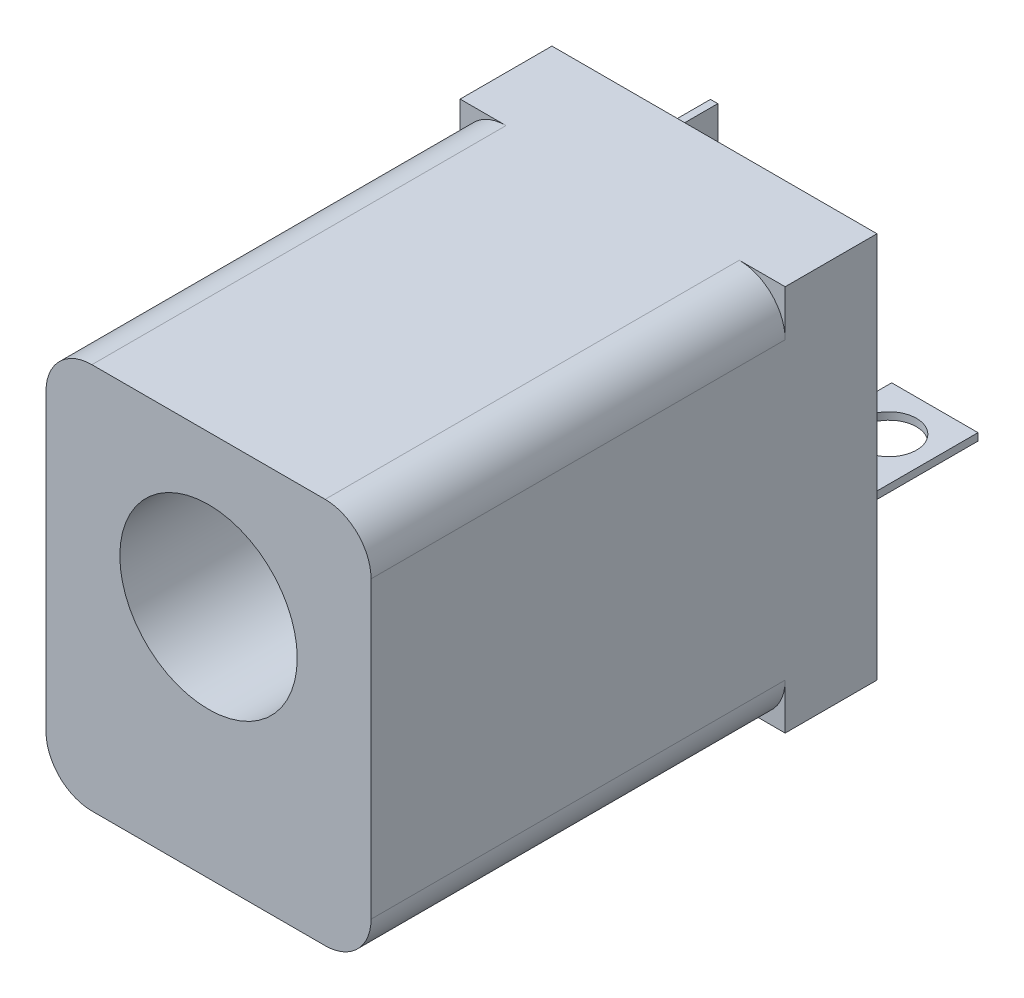
ISO-10303-21;
HEADER;
FILE_DESCRIPTION(('STEP AP214'),'2;1');
FILE_NAME('part.step','',(''),(''),'','','');
FILE_SCHEMA(('AUTOMOTIVE_DESIGN { 1 0 10303 214 1 1 1 1 }'));
ENDSEC;
DATA;
#1=APPLICATION_CONTEXT('core data for automotive mechanical design processes');
#2=APPLICATION_PROTOCOL_DEFINITION('international standard','automotive_design',2000,#1);
#3=PRODUCT_CONTEXT('',#1,'mechanical');
#4=PRODUCT('Part','Part','',(#3));
#5=PRODUCT_RELATED_PRODUCT_CATEGORY('part','',(#4));
#6=PRODUCT_DEFINITION_FORMATION('','',#4);
#7=PRODUCT_DEFINITION_CONTEXT('part definition',#1,'design');
#8=PRODUCT_DEFINITION('design','',#6,#7);
#9=PRODUCT_DEFINITION_SHAPE('','',#8);
#10=(LENGTH_UNIT() NAMED_UNIT(*) SI_UNIT(.MILLI.,.METRE.));
#11=(NAMED_UNIT(*) PLANE_ANGLE_UNIT() SI_UNIT($,.RADIAN.));
#12=(NAMED_UNIT(*) SI_UNIT($,.STERADIAN.) SOLID_ANGLE_UNIT());
#13=UNCERTAINTY_MEASURE_WITH_UNIT(LENGTH_MEASURE(1.E-05),#10,'distance_accuracy_value','');
#14=(GEOMETRIC_REPRESENTATION_CONTEXT(3) GLOBAL_UNCERTAINTY_ASSIGNED_CONTEXT((#13)) GLOBAL_UNIT_ASSIGNED_CONTEXT((#10,
#11,#12)) REPRESENTATION_CONTEXT('',''));
#15=CARTESIAN_POINT('',(0.,0.,0.));
#16=DIRECTION('',(0.,0.,1.));
#17=DIRECTION('',(1.,0.,0.));
#18=AXIS2_PLACEMENT_3D('',#15,#16,#17);
#19=CARTESIAN_POINT('',(1.27,1.27,-13.9954));
#20=DIRECTION('',(0.,0.,1.));
#21=DIRECTION('',(1.,0.,0.));
#22=AXIS2_PLACEMENT_3D('',#19,#20,#21);
#23=PLANE('',#22);
#24=DIRECTION('',(0.,-1.,0.));
#25=VECTOR('',#24,1.);
#26=CARTESIAN_POINT('',(4.4069,1.20396,-13.9954));
#27=LINE('',#26,#25);
#28=CARTESIAN_POINT('',(4.4069,1.20396,-13.9954));
#29=VERTEX_POINT('',#28);
#30=CARTESIAN_POINT('',(4.4069,1.00076,-13.9954));
#31=VERTEX_POINT('',#30);
#32=EDGE_CURVE('E224',#29,#31,#27,.T.);
#33=ORIENTED_EDGE('',*,*,#32,.F.);
#34=DIRECTION('',(1.,0.,0.));
#35=VECTOR('',#34,1.);
#36=CARTESIAN_POINT('',(4.4069,1.20396,-13.9954));
#37=LINE('',#36,#35);
#38=CARTESIAN_POINT('',(2.1971,1.20396,-13.9954));
#39=VERTEX_POINT('',#38);
#40=EDGE_CURVE('E242',#39,#29,#37,.T.);
#41=ORIENTED_EDGE('',*,*,#40,.F.);
#42=DIRECTION('',(0.,1.,0.));
#43=VECTOR('',#42,1.);
#44=CARTESIAN_POINT('',(2.1971,1.20396,-13.9954));
#45=LINE('',#44,#43);
#46=CARTESIAN_POINT('',(2.1971,1.00076,-13.9954));
#47=VERTEX_POINT('',#46);
#48=EDGE_CURVE('E255',#47,#39,#45,.T.);
#49=ORIENTED_EDGE('',*,*,#48,.F.);
#50=DIRECTION('',(-1.,0.,0.));
#51=VECTOR('',#50,1.);
#52=CARTESIAN_POINT('',(4.4069,1.00076,-13.9954));
#53=LINE('',#52,#51);
#54=EDGE_CURVE('E230',#31,#47,#53,.T.);
#55=ORIENTED_EDGE('',*,*,#54,.F.);
#56=EDGE_LOOP('',(#33,#41,#49,#55));
#57=FACE_BOUND('',#56,.T.);
#58=DIRECTION('',(1.,0.,0.));
#59=VECTOR('',#58,1.);
#60=CARTESIAN_POINT('',(1.27000000000001,0.,-13.9954));
#61=LINE('',#60,#59);
#62=CARTESIAN_POINT('',(0.,0.,-13.9954));
#63=VERTEX_POINT('',#62);
#64=CARTESIAN_POINT('',(8.9916,0.,-13.9954));
#65=VERTEX_POINT('',#64);
#66=EDGE_CURVE('E377',#63,#65,#61,.T.);
#67=ORIENTED_EDGE('',*,*,#66,.F.);
#68=DIRECTION('',(0.,-1.,0.));
#69=VECTOR('',#68,1.);
#70=CARTESIAN_POINT('',(0.,1.27000000000001,-13.9954));
#71=LINE('',#70,#69);
#72=CARTESIAN_POINT('',(0.,10.6934,-13.9954));
#73=VERTEX_POINT('',#72);
#74=EDGE_CURVE('E388',#73,#63,#71,.T.);
#75=ORIENTED_EDGE('',*,*,#74,.F.);
#76=DIRECTION('',(-1.,0.,0.));
#77=VECTOR('',#76,1.);
#78=CARTESIAN_POINT('',(1.27000000000001,10.6934,-13.9954));
#79=LINE('',#78,#77);
#80=CARTESIAN_POINT('',(8.9916,10.6934,-13.9954));
#81=VERTEX_POINT('',#80);
#82=EDGE_CURVE('E385',#81,#73,#79,.T.);
#83=ORIENTED_EDGE('',*,*,#82,.F.);
#84=DIRECTION('',(0.,1.,0.));
#85=VECTOR('',#84,1.);
#86=CARTESIAN_POINT('',(8.9916,1.27000000000001,-13.9954));
#87=LINE('',#86,#85);
#88=EDGE_CURVE('E381',#65,#81,#87,.T.);
#89=ORIENTED_EDGE('',*,*,#88,.F.);
#90=EDGE_LOOP('',(#67,#75,#83,#89));
#91=FACE_BOUND('',#90,.T.);
#92=DIRECTION('',(0.,-1.,0.));
#93=VECTOR('',#92,1.);
#94=CARTESIAN_POINT('',(0.980439999999999,8.001,-13.9954));
#95=LINE('',#94,#93);
#96=CARTESIAN_POINT('',(0.980439999999999,8.001,-13.9954));
#97=VERTEX_POINT('',#96);
#98=CARTESIAN_POINT('',(0.980439999999999,5.0038,-13.9954));
#99=VERTEX_POINT('',#98);
#100=EDGE_CURVE('E276',#97,#99,#95,.T.);
#101=ORIENTED_EDGE('',*,*,#100,.F.);
#102=DIRECTION('',(1.,0.,0.));
#103=VECTOR('',#102,1.);
#104=CARTESIAN_POINT('',(0.980439999999999,8.001,-13.9954));
#105=LINE('',#104,#103);
#106=CARTESIAN_POINT('',(0.777239999999999,8.001,-13.9954));
#107=VERTEX_POINT('',#106);
#108=EDGE_CURVE('E281',#107,#97,#105,.T.);
#109=ORIENTED_EDGE('',*,*,#108,.F.);
#110=DIRECTION('',(0.,1.,0.));
#111=VECTOR('',#110,1.);
#112=CARTESIAN_POINT('',(0.777239999999999,8.001,-13.9954));
#113=LINE('',#112,#111);
#114=CARTESIAN_POINT('',(0.777239999999999,5.0038,-13.9954));
#115=VERTEX_POINT('',#114);
#116=EDGE_CURVE('E298',#115,#107,#113,.T.);
#117=ORIENTED_EDGE('',*,*,#116,.F.);
#118=DIRECTION('',(-1.,0.,0.));
#119=VECTOR('',#118,1.);
#120=CARTESIAN_POINT('',(0.980439999999999,5.0038,-13.9954));
#121=LINE('',#120,#119);
#122=EDGE_CURVE('E294',#99,#115,#121,.T.);
#123=ORIENTED_EDGE('',*,*,#122,.F.);
#124=EDGE_LOOP('',(#101,#109,#117,#123));
#125=FACE_BOUND('',#124,.T.);
#126=DIRECTION('',(0.,-1.,0.));
#127=VECTOR('',#126,1.);
#128=CARTESIAN_POINT('',(8.1788,3.71856,-13.9954));
#129=LINE('',#128,#127);
#130=CARTESIAN_POINT('',(8.1788,3.71856,-13.9954));
#131=VERTEX_POINT('',#130);
#132=CARTESIAN_POINT('',(8.1788,3.51536,-13.9954));
#133=VERTEX_POINT('',#132);
#134=EDGE_CURVE('E222',#131,#133,#129,.T.);
#135=ORIENTED_EDGE('',*,*,#134,.F.);
#136=DIRECTION('',(1.,0.,0.));
#137=VECTOR('',#136,1.);
#138=CARTESIAN_POINT('',(8.1788,3.71856,-13.9954));
#139=LINE('',#138,#137);
#140=CARTESIAN_POINT('',(5.7912,3.71856,-13.9954));
#141=VERTEX_POINT('',#140);
#142=EDGE_CURVE('E219',#141,#131,#139,.T.);
#143=ORIENTED_EDGE('',*,*,#142,.F.);
#144=DIRECTION('',(0.,1.,0.));
#145=VECTOR('',#144,1.);
#146=CARTESIAN_POINT('',(5.7912,3.71856,-13.9954));
#147=LINE('',#146,#145);
#148=CARTESIAN_POINT('',(5.7912,3.51536,-13.9954));
#149=VERTEX_POINT('',#148);
#150=EDGE_CURVE('E60',#149,#141,#147,.T.);
#151=ORIENTED_EDGE('',*,*,#150,.F.);
#152=DIRECTION('',(-1.,0.,0.));
#153=VECTOR('',#152,1.);
#154=CARTESIAN_POINT('',(8.1788,3.51536,-13.9954));
#155=LINE('',#154,#153);
#156=EDGE_CURVE('E55',#133,#149,#155,.T.);
#157=ORIENTED_EDGE('',*,*,#156,.F.);
#158=EDGE_LOOP('',(#135,#143,#151,#157));
#159=FACE_BOUND('',#158,.T.);
#160=ADVANCED_FACE('F37',(#57,#91,#125,#159),#23,.F.);
#161=CARTESIAN_POINT('',(1.27,1.27,-13.9954));
#162=DIRECTION('',(0.,0.,1.));
#163=DIRECTION('',(1.,0.,0.));
#164=AXIS2_PLACEMENT_3D('',#161,#162,#163);
#165=CYLINDRICAL_SURFACE('',#164,1.27);
#166=DIRECTION('',(0.,0.,1.));
#167=VECTOR('',#166,1.);
#168=CARTESIAN_POINT('',(0.,1.27000000000001,-13.9954));
#169=LINE('',#168,#167);
#170=CARTESIAN_POINT('',(0.,1.27000000000001,-11.4554));
#171=VERTEX_POINT('',#170);
#172=CARTESIAN_POINT('',(0.,1.27000000000001,0.));
#173=VERTEX_POINT('',#172);
#174=EDGE_CURVE('E11',#171,#173,#169,.T.);
#175=ORIENTED_EDGE('',*,*,#174,.F.);
#176=CARTESIAN_POINT('',(1.27,1.27,-11.4554));
#177=DIRECTION('',(0.,0.,-1.));
#178=DIRECTION('',(-1.,0.,0.));
#179=AXIS2_PLACEMENT_3D('',#176,#177,#178);
#180=CIRCLE('',#179,1.27);
#181=CARTESIAN_POINT('',(1.27000000000001,0.,-11.4554));
#182=VERTEX_POINT('',#181);
#183=EDGE_CURVE('E365',#171,#182,#180,.F.);
#184=ORIENTED_EDGE('',*,*,#183,.T.);
#185=DIRECTION('',(0.,0.,1.));
#186=VECTOR('',#185,1.);
#187=CARTESIAN_POINT('',(1.27000000000001,0.,-13.9954));
#188=LINE('',#187,#186);
#189=CARTESIAN_POINT('',(1.27000000000001,0.,0.));
#190=VERTEX_POINT('',#189);
#191=EDGE_CURVE('E41',#182,#190,#188,.T.);
#192=ORIENTED_EDGE('',*,*,#191,.T.);
#193=CARTESIAN_POINT('',(1.27,1.27,0.));
#194=DIRECTION('',(0.,0.,1.));
#195=DIRECTION('',(1.,0.,0.));
#196=AXIS2_PLACEMENT_3D('',#193,#194,#195);
#197=CIRCLE('',#196,1.27);
#198=EDGE_CURVE('E373',#173,#190,#197,.T.);
#199=ORIENTED_EDGE('',*,*,#198,.F.);
#200=EDGE_LOOP('',(#175,#184,#192,#199));
#201=FACE_BOUND('',#200,.T.);
#202=ADVANCED_FACE('F39',(#201),#165,.T.);
#203=CARTESIAN_POINT('',(1.27,9.4234,-13.9954));
#204=DIRECTION('',(0.,0.,1.));
#205=DIRECTION('',(1.,0.,0.));
#206=AXIS2_PLACEMENT_3D('',#203,#204,#205);
#207=CYLINDRICAL_SURFACE('',#206,1.27);
#208=DIRECTION('',(0.,0.,1.));
#209=VECTOR('',#208,1.);
#210=CARTESIAN_POINT('',(1.27000000000001,10.6934,-13.9954));
#211=LINE('',#210,#209);
#212=CARTESIAN_POINT('',(1.27000000000001,10.6934,-11.4554));
#213=VERTEX_POINT('',#212);
#214=CARTESIAN_POINT('',(1.27000000000001,10.6934,0.));
#215=VERTEX_POINT('',#214);
#216=EDGE_CURVE('E423',#213,#215,#211,.T.);
#217=ORIENTED_EDGE('',*,*,#216,.F.);
#218=CARTESIAN_POINT('',(1.27,9.4234,-11.4554));
#219=DIRECTION('',(0.,0.,-1.));
#220=DIRECTION('',(-1.,0.,0.));
#221=AXIS2_PLACEMENT_3D('',#218,#219,#220);
#222=CIRCLE('',#221,1.27);
#223=CARTESIAN_POINT('',(0.,9.42339999999999,-11.4554));
#224=VERTEX_POINT('',#223);
#225=EDGE_CURVE('E362',#213,#224,#222,.F.);
#226=ORIENTED_EDGE('',*,*,#225,.T.);
#227=DIRECTION('',(0.,0.,1.));
#228=VECTOR('',#227,1.);
#229=CARTESIAN_POINT('',(0.,9.42339999999999,-13.9954));
#230=LINE('',#229,#228);
#231=CARTESIAN_POINT('',(0.,9.42339999999999,0.));
#232=VERTEX_POINT('',#231);
#233=EDGE_CURVE('E47',#224,#232,#230,.T.);
#234=ORIENTED_EDGE('',*,*,#233,.T.);
#235=CARTESIAN_POINT('',(1.27,9.4234,0.));
#236=DIRECTION('',(0.,0.,1.));
#237=DIRECTION('',(1.,0.,0.));
#238=AXIS2_PLACEMENT_3D('',#235,#236,#237);
#239=CIRCLE('',#238,1.27);
#240=EDGE_CURVE('E414',#215,#232,#239,.T.);
#241=ORIENTED_EDGE('',*,*,#240,.F.);
#242=EDGE_LOOP('',(#217,#226,#234,#241));
#243=FACE_BOUND('',#242,.T.);
#244=ADVANCED_FACE('F512',(#243),#207,.T.);
#245=CARTESIAN_POINT('',(7.7216,9.4234,-13.9954));
#246=DIRECTION('',(0.,0.,1.));
#247=DIRECTION('',(1.,0.,0.));
#248=AXIS2_PLACEMENT_3D('',#245,#246,#247);
#249=CYLINDRICAL_SURFACE('',#248,1.27);
#250=DIRECTION('',(0.,0.,1.));
#251=VECTOR('',#250,1.);
#252=CARTESIAN_POINT('',(8.9916,9.42339999999999,-13.9954));
#253=LINE('',#252,#251);
#254=CARTESIAN_POINT('',(8.9916,9.42339999999999,-11.4554));
#255=VERTEX_POINT('',#254);
#256=CARTESIAN_POINT('',(8.9916,9.42339999999999,0.));
#257=VERTEX_POINT('',#256);
#258=EDGE_CURVE('E429',#255,#257,#253,.T.);
#259=ORIENTED_EDGE('',*,*,#258,.F.);
#260=CARTESIAN_POINT('',(7.7216,9.4234,-11.4554));
#261=DIRECTION('',(0.,0.,-1.));
#262=DIRECTION('',(-1.,0.,0.));
#263=AXIS2_PLACEMENT_3D('',#260,#261,#262);
#264=CIRCLE('',#263,1.27);
#265=CARTESIAN_POINT('',(7.72159999999999,10.6934,-11.4554));
#266=VERTEX_POINT('',#265);
#267=EDGE_CURVE('E359',#255,#266,#264,.F.);
#268=ORIENTED_EDGE('',*,*,#267,.T.);
#269=DIRECTION('',(0.,0.,1.));
#270=VECTOR('',#269,1.);
#271=CARTESIAN_POINT('',(7.72159999999999,10.6934,-13.9954));
#272=LINE('',#271,#270);
#273=CARTESIAN_POINT('',(7.72159999999999,10.6934,0.));
#274=VERTEX_POINT('',#273);
#275=EDGE_CURVE('E426',#266,#274,#272,.T.);
#276=ORIENTED_EDGE('',*,*,#275,.T.);
#277=CARTESIAN_POINT('',(7.7216,9.4234,0.));
#278=DIRECTION('',(0.,0.,1.));
#279=DIRECTION('',(1.,0.,0.));
#280=AXIS2_PLACEMENT_3D('',#277,#278,#279);
#281=CIRCLE('',#280,1.27);
#282=EDGE_CURVE('E406',#257,#274,#281,.T.);
#283=ORIENTED_EDGE('',*,*,#282,.F.);
#284=EDGE_LOOP('',(#259,#268,#276,#283));
#285=FACE_BOUND('',#284,.T.);
#286=ADVANCED_FACE('F527',(#285),#249,.T.);
#287=CARTESIAN_POINT('',(7.7216,1.27,-13.9954));
#288=DIRECTION('',(0.,0.,1.));
#289=DIRECTION('',(1.,0.,0.));
#290=AXIS2_PLACEMENT_3D('',#287,#288,#289);
#291=CYLINDRICAL_SURFACE('',#290,1.27);
#292=DIRECTION('',(0.,0.,1.));
#293=VECTOR('',#292,1.);
#294=CARTESIAN_POINT('',(7.72159999999999,0.,-13.9954));
#295=LINE('',#294,#293);
#296=CARTESIAN_POINT('',(7.72159999999999,0.,-11.4554));
#297=VERTEX_POINT('',#296);
#298=CARTESIAN_POINT('',(7.72159999999999,0.,0.));
#299=VERTEX_POINT('',#298);
#300=EDGE_CURVE('E434',#297,#299,#295,.T.);
#301=ORIENTED_EDGE('',*,*,#300,.F.);
#302=CARTESIAN_POINT('',(7.7216,1.27,-11.4554));
#303=DIRECTION('',(0.,0.,-1.));
#304=DIRECTION('',(-1.,0.,0.));
#305=AXIS2_PLACEMENT_3D('',#302,#303,#304);
#306=CIRCLE('',#305,1.27);
#307=CARTESIAN_POINT('',(8.9916,1.27000000000001,-11.4554));
#308=VERTEX_POINT('',#307);
#309=EDGE_CURVE('E345',#297,#308,#306,.F.);
#310=ORIENTED_EDGE('',*,*,#309,.T.);
#311=DIRECTION('',(0.,0.,1.));
#312=VECTOR('',#311,1.);
#313=CARTESIAN_POINT('',(8.9916,1.27000000000001,-13.9954));
#314=LINE('',#313,#312);
#315=CARTESIAN_POINT('',(8.9916,1.27000000000001,0.));
#316=VERTEX_POINT('',#315);
#317=EDGE_CURVE('E432',#308,#316,#314,.T.);
#318=ORIENTED_EDGE('',*,*,#317,.T.);
#319=CARTESIAN_POINT('',(7.7216,1.27,0.));
#320=DIRECTION('',(0.,0.,1.));
#321=DIRECTION('',(1.,0.,0.));
#322=AXIS2_PLACEMENT_3D('',#319,#320,#321);
#323=CIRCLE('',#322,1.27);
#324=EDGE_CURVE('E398',#299,#316,#323,.T.);
#325=ORIENTED_EDGE('',*,*,#324,.F.);
#326=EDGE_LOOP('',(#301,#310,#318,#325));
#327=FACE_BOUND('',#326,.T.);
#328=ADVANCED_FACE('F524',(#327),#291,.T.);
#329=CARTESIAN_POINT('',(0.,1.27000000000001,-13.9954));
#330=DIRECTION('',(-1.,0.,0.));
#331=DIRECTION('',(0.,0.,1.));
#332=AXIS2_PLACEMENT_3D('',#329,#330,#331);
#333=PLANE('',#332);
#334=ORIENTED_EDGE('',*,*,#74,.T.);
#335=DIRECTION('',(0.,0.,-1.));
#336=VECTOR('',#335,1.);
#337=CARTESIAN_POINT('',(0.,0.,-11.4554));
#338=LINE('',#337,#336);
#339=CARTESIAN_POINT('',(0.,0.,-11.4554));
#340=VERTEX_POINT('',#339);
#341=EDGE_CURVE('E350',#340,#63,#338,.T.);
#342=ORIENTED_EDGE('',*,*,#341,.F.);
#343=DIRECTION('',(0.,1.,0.));
#344=VECTOR('',#343,1.);
#345=CARTESIAN_POINT('',(0.,10.6934,-11.4554));
#346=LINE('',#345,#344);
#347=EDGE_CURVE('E331',#340,#171,#346,.T.);
#348=ORIENTED_EDGE('',*,*,#347,.T.);
#349=ORIENTED_EDGE('',*,*,#174,.T.);
#350=DIRECTION('',(0.,-1.,0.));
#351=VECTOR('',#350,1.);
#352=CARTESIAN_POINT('',(0.,1.27000000000001,0.));
#353=LINE('',#352,#351);
#354=EDGE_CURVE('E382',#232,#173,#353,.T.);
#355=ORIENTED_EDGE('',*,*,#354,.F.);
#356=ORIENTED_EDGE('',*,*,#233,.F.);
#357=CARTESIAN_POINT('',(0.,10.6934,-11.4554));
#358=VERTEX_POINT('',#357);
#359=EDGE_CURVE('E330',#224,#358,#346,.T.);
#360=ORIENTED_EDGE('',*,*,#359,.T.);
#361=DIRECTION('',(0.,0.,-1.));
#362=VECTOR('',#361,1.);
#363=CARTESIAN_POINT('',(0.,10.6934,-11.4554));
#364=LINE('',#363,#362);
#365=EDGE_CURVE('E346',#358,#73,#364,.T.);
#366=ORIENTED_EDGE('',*,*,#365,.T.);
#367=EDGE_LOOP('',(#334,#342,#348,#349,#355,#356,#360,#366));
#368=FACE_BOUND('',#367,.T.);
#369=ADVANCED_FACE('F453',(#368),#333,.T.);
#370=CARTESIAN_POINT('',(1.27000000000001,10.6934,-13.9954));
#371=DIRECTION('',(0.,1.,0.));
#372=DIRECTION('',(0.,0.,1.));
#373=AXIS2_PLACEMENT_3D('',#370,#371,#372);
#374=PLANE('',#373);
#375=ORIENTED_EDGE('',*,*,#82,.T.);
#376=ORIENTED_EDGE('',*,*,#365,.F.);
#377=DIRECTION('',(1.,0.,0.));
#378=VECTOR('',#377,1.);
#379=CARTESIAN_POINT('',(8.9916,10.6934,-11.4554));
#380=LINE('',#379,#378);
#381=EDGE_CURVE('E336',#358,#213,#380,.T.);
#382=ORIENTED_EDGE('',*,*,#381,.T.);
#383=ORIENTED_EDGE('',*,*,#216,.T.);
#384=DIRECTION('',(-1.,0.,0.));
#385=VECTOR('',#384,1.);
#386=CARTESIAN_POINT('',(1.27000000000001,10.6934,0.));
#387=LINE('',#386,#385);
#388=EDGE_CURVE('E410',#274,#215,#387,.T.);
#389=ORIENTED_EDGE('',*,*,#388,.F.);
#390=ORIENTED_EDGE('',*,*,#275,.F.);
#391=CARTESIAN_POINT('',(8.9916,10.6934,-11.4554));
#392=VERTEX_POINT('',#391);
#393=EDGE_CURVE('E335',#266,#392,#380,.T.);
#394=ORIENTED_EDGE('',*,*,#393,.T.);
#395=DIRECTION('',(0.,0.,-1.));
#396=VECTOR('',#395,1.);
#397=CARTESIAN_POINT('',(8.9916,10.6934,-11.4554));
#398=LINE('',#397,#396);
#399=EDGE_CURVE('E341',#392,#81,#398,.T.);
#400=ORIENTED_EDGE('',*,*,#399,.T.);
#401=EDGE_LOOP('',(#375,#376,#382,#383,#389,#390,#394,#400));
#402=FACE_BOUND('',#401,.T.);
#403=ADVANCED_FACE('F523',(#402),#374,.T.);
#404=CARTESIAN_POINT('',(8.9916,1.27000000000001,-13.9954));
#405=DIRECTION('',(1.,0.,0.));
#406=DIRECTION('',(0.,0.,-1.));
#407=AXIS2_PLACEMENT_3D('',#404,#405,#406);
#408=PLANE('',#407);
#409=ORIENTED_EDGE('',*,*,#88,.T.);
#410=ORIENTED_EDGE('',*,*,#399,.F.);
#411=DIRECTION('',(0.,-1.,0.));
#412=VECTOR('',#411,1.);
#413=CARTESIAN_POINT('',(8.9916,10.6934,-11.4554));
#414=LINE('',#413,#412);
#415=EDGE_CURVE('E321',#392,#255,#414,.T.);
#416=ORIENTED_EDGE('',*,*,#415,.T.);
#417=ORIENTED_EDGE('',*,*,#258,.T.);
#418=DIRECTION('',(0.,1.,0.));
#419=VECTOR('',#418,1.);
#420=CARTESIAN_POINT('',(8.9916,1.27000000000001,0.));
#421=LINE('',#420,#419);
#422=EDGE_CURVE('E402',#316,#257,#421,.T.);
#423=ORIENTED_EDGE('',*,*,#422,.F.);
#424=ORIENTED_EDGE('',*,*,#317,.F.);
#425=CARTESIAN_POINT('',(8.9916,0.,-11.4554));
#426=VERTEX_POINT('',#425);
#427=EDGE_CURVE('E320',#308,#426,#414,.T.);
#428=ORIENTED_EDGE('',*,*,#427,.T.);
#429=DIRECTION('',(0.,0.,-1.));
#430=VECTOR('',#429,1.);
#431=CARTESIAN_POINT('',(8.9916,0.,-11.4554));
#432=LINE('',#431,#430);
#433=EDGE_CURVE('E340',#426,#65,#432,.T.);
#434=ORIENTED_EDGE('',*,*,#433,.T.);
#435=EDGE_LOOP('',(#409,#410,#416,#417,#423,#424,#428,#434));
#436=FACE_BOUND('',#435,.T.);
#437=ADVANCED_FACE('F531',(#436),#408,.T.);
#438=CARTESIAN_POINT('',(1.27000000000001,0.,-13.9954));
#439=DIRECTION('',(0.,-1.,0.));
#440=DIRECTION('',(0.,0.,-1.));
#441=AXIS2_PLACEMENT_3D('',#438,#439,#440);
#442=PLANE('',#441);
#443=ORIENTED_EDGE('',*,*,#66,.T.);
#444=ORIENTED_EDGE('',*,*,#433,.F.);
#445=DIRECTION('',(-1.,0.,0.));
#446=VECTOR('',#445,1.);
#447=CARTESIAN_POINT('',(8.9916,0.,-11.4554));
#448=LINE('',#447,#446);
#449=EDGE_CURVE('E326',#426,#297,#448,.T.);
#450=ORIENTED_EDGE('',*,*,#449,.T.);
#451=ORIENTED_EDGE('',*,*,#300,.T.);
#452=DIRECTION('',(1.,0.,0.));
#453=VECTOR('',#452,1.);
#454=CARTESIAN_POINT('',(1.27000000000001,0.,0.));
#455=LINE('',#454,#453);
#456=EDGE_CURVE('E394',#190,#299,#455,.T.);
#457=ORIENTED_EDGE('',*,*,#456,.F.);
#458=ORIENTED_EDGE('',*,*,#191,.F.);
#459=EDGE_CURVE('E325',#182,#340,#448,.T.);
#460=ORIENTED_EDGE('',*,*,#459,.T.);
#461=ORIENTED_EDGE('',*,*,#341,.T.);
#462=EDGE_LOOP('',(#443,#444,#450,#451,#457,#458,#460,#461));
#463=FACE_BOUND('',#462,.T.);
#464=ADVANCED_FACE('F446',(#463),#442,.T.);
#465=CARTESIAN_POINT('',(1.27,1.27,0.));
#466=DIRECTION('',(0.,0.,1.));
#467=DIRECTION('',(1.,0.,0.));
#468=AXIS2_PLACEMENT_3D('',#465,#466,#467);
#469=PLANE('',#468);
#470=CARTESIAN_POINT('',(4.4958,6.5024,0.));
#471=DIRECTION('',(0.,0.,1.));
#472=DIRECTION('',(1.,0.,0.));
#473=AXIS2_PLACEMENT_3D('',#470,#471,#472);
#474=CIRCLE('',#473,2.45375857682909);
#475=CARTESIAN_POINT('',(6.94955857682909,6.5024,0.));
#476=VERTEX_POINT('',#475);
#477=EDGE_CURVE('E368',#476,#476,#474,.T.);
#478=ORIENTED_EDGE('',*,*,#477,.F.);
#479=EDGE_LOOP('',(#478));
#480=FACE_BOUND('',#479,.T.);
#481=ORIENTED_EDGE('',*,*,#198,.T.);
#482=ORIENTED_EDGE('',*,*,#456,.T.);
#483=ORIENTED_EDGE('',*,*,#324,.T.);
#484=ORIENTED_EDGE('',*,*,#422,.T.);
#485=ORIENTED_EDGE('',*,*,#282,.T.);
#486=ORIENTED_EDGE('',*,*,#388,.T.);
#487=ORIENTED_EDGE('',*,*,#240,.T.);
#488=ORIENTED_EDGE('',*,*,#354,.T.);
#489=EDGE_LOOP('',(#481,#482,#483,#484,#485,#486,#487,#488));
#490=FACE_BOUND('',#489,.T.);
#491=ADVANCED_FACE('F448',(#480,#490),#469,.T.);
#492=CARTESIAN_POINT('',(4.4958,6.5024,-9.2456));
#493=DIRECTION('',(0.,0.,1.));
#494=DIRECTION('',(1.,0.,0.));
#495=AXIS2_PLACEMENT_3D('',#492,#493,#494);
#496=CYLINDRICAL_SURFACE('',#495,2.45375857682909);
#497=CARTESIAN_POINT('',(4.4958,6.5024,-9.2456));
#498=DIRECTION('',(0.,0.,1.));
#499=DIRECTION('',(1.,0.,0.));
#500=AXIS2_PLACEMENT_3D('',#497,#498,#499);
#501=CIRCLE('',#500,2.45375857682909);
#502=CARTESIAN_POINT('',(6.94955857682909,6.5024,-9.2456));
#503=VERTEX_POINT('',#502);
#504=EDGE_CURVE('E369',#503,#503,#501,.T.);
#505=ORIENTED_EDGE('',*,*,#504,.F.);
#506=EDGE_LOOP('',(#505));
#507=FACE_BOUND('',#506,.T.);
#508=ORIENTED_EDGE('',*,*,#477,.T.);
#509=EDGE_LOOP('',(#508));
#510=FACE_BOUND('',#509,.T.);
#511=ADVANCED_FACE('F516',(#507,#510),#496,.F.);
#512=CARTESIAN_POINT('',(4.4958,6.5024,-9.2456));
#513=DIRECTION('',(0.,0.,1.));
#514=DIRECTION('',(1.,0.,0.));
#515=AXIS2_PLACEMENT_3D('',#512,#513,#514);
#516=PLANE('',#515);
#517=ORIENTED_EDGE('',*,*,#504,.T.);
#518=EDGE_LOOP('',(#517));
#519=FACE_BOUND('',#518,.T.);
#520=ADVANCED_FACE('F554',(#519),#516,.T.);
#521=CARTESIAN_POINT('',(0.,0.,-11.4554));
#522=DIRECTION('',(0.,0.,-1.));
#523=DIRECTION('',(-1.,0.,0.));
#524=AXIS2_PLACEMENT_3D('',#521,#522,#523);
#525=PLANE('',#524);
#526=ORIENTED_EDGE('',*,*,#309,.F.);
#527=ORIENTED_EDGE('',*,*,#449,.F.);
#528=ORIENTED_EDGE('',*,*,#427,.F.);
#529=EDGE_LOOP('',(#526,#527,#528));
#530=FACE_BOUND('',#529,.T.);
#531=ADVANCED_FACE('F560',(#530),#525,.F.);
#532=ORIENTED_EDGE('',*,*,#267,.F.);
#533=ORIENTED_EDGE('',*,*,#415,.F.);
#534=ORIENTED_EDGE('',*,*,#393,.F.);
#535=EDGE_LOOP('',(#532,#533,#534));
#536=FACE_BOUND('',#535,.T.);
#537=ADVANCED_FACE('F566',(#536),#525,.F.);
#538=ORIENTED_EDGE('',*,*,#225,.F.);
#539=ORIENTED_EDGE('',*,*,#381,.F.);
#540=ORIENTED_EDGE('',*,*,#359,.F.);
#541=EDGE_LOOP('',(#538,#539,#540));
#542=FACE_BOUND('',#541,.T.);
#543=ADVANCED_FACE('F573',(#542),#525,.F.);
#544=ORIENTED_EDGE('',*,*,#183,.F.);
#545=ORIENTED_EDGE('',*,*,#347,.F.);
#546=ORIENTED_EDGE('',*,*,#459,.F.);
#547=EDGE_LOOP('',(#544,#545,#546));
#548=FACE_BOUND('',#547,.T.);
#549=ADVANCED_FACE('F458',(#548),#525,.F.);
#550=CARTESIAN_POINT('',(0.980439999999999,8.001,-17.6022));
#551=DIRECTION('',(-1.,0.,0.));
#552=DIRECTION('',(0.,0.,1.));
#553=AXIS2_PLACEMENT_3D('',#550,#551,#552);
#554=PLANE('',#553);
#555=CARTESIAN_POINT('',(0.980439999999999,6.5024,-16.0782));
#556=DIRECTION('',(1.,0.,0.));
#557=DIRECTION('',(0.,0.,-1.));
#558=AXIS2_PLACEMENT_3D('',#555,#556,#557);
#559=CIRCLE('',#558,0.761999999999999);
#560=CARTESIAN_POINT('',(0.980439999999999,6.5024,-16.8402));
#561=VERTEX_POINT('',#560);
#562=EDGE_CURVE('E464',#561,#561,#559,.T.);
#563=ORIENTED_EDGE('',*,*,#562,.F.);
#564=EDGE_LOOP('',(#563));
#565=FACE_BOUND('',#564,.T.);
#566=ORIENTED_EDGE('',*,*,#100,.T.);
#567=DIRECTION('',(0.,0.,1.));
#568=VECTOR('',#567,1.);
#569=CARTESIAN_POINT('',(0.980439999999999,5.0038,-17.6022));
#570=LINE('',#569,#568);
#571=CARTESIAN_POINT('',(0.980439999999999,5.0038,-17.6022));
#572=VERTEX_POINT('',#571);
#573=EDGE_CURVE('E316',#572,#99,#570,.T.);
#574=ORIENTED_EDGE('',*,*,#573,.F.);
#575=DIRECTION('',(0.,-1.,0.));
#576=VECTOR('',#575,1.);
#577=CARTESIAN_POINT('',(0.980439999999999,8.001,-17.6022));
#578=LINE('',#577,#576);
#579=CARTESIAN_POINT('',(0.980439999999999,8.001,-17.6022));
#580=VERTEX_POINT('',#579);
#581=EDGE_CURVE('E277',#580,#572,#578,.T.);
#582=ORIENTED_EDGE('',*,*,#581,.F.);
#583=DIRECTION('',(0.,0.,1.));
#584=VECTOR('',#583,1.);
#585=CARTESIAN_POINT('',(0.980439999999999,8.001,-17.6022));
#586=LINE('',#585,#584);
#587=EDGE_CURVE('E290',#580,#97,#586,.T.);
#588=ORIENTED_EDGE('',*,*,#587,.T.);
#589=EDGE_LOOP('',(#566,#574,#582,#588));
#590=FACE_BOUND('',#589,.T.);
#591=ADVANCED_FACE('F584',(#565,#590),#554,.F.);
#592=CARTESIAN_POINT('',(0.980439999999999,5.0038,-17.6022));
#593=DIRECTION('',(0.,1.,0.));
#594=DIRECTION('',(0.,0.,1.));
#595=AXIS2_PLACEMENT_3D('',#592,#593,#594);
#596=PLANE('',#595);
#597=ORIENTED_EDGE('',*,*,#122,.T.);
#598=DIRECTION('',(0.,0.,1.));
#599=VECTOR('',#598,1.);
#600=CARTESIAN_POINT('',(0.777239999999999,5.0038,-17.6022));
#601=LINE('',#600,#599);
#602=CARTESIAN_POINT('',(0.777239999999999,5.0038,-17.6022));
#603=VERTEX_POINT('',#602);
#604=EDGE_CURVE('E312',#603,#115,#601,.T.);
#605=ORIENTED_EDGE('',*,*,#604,.F.);
#606=DIRECTION('',(-1.,0.,0.));
#607=VECTOR('',#606,1.);
#608=CARTESIAN_POINT('',(0.980439999999999,5.0038,-17.6022));
#609=LINE('',#608,#607);
#610=EDGE_CURVE('E280',#572,#603,#609,.T.);
#611=ORIENTED_EDGE('',*,*,#610,.F.);
#612=ORIENTED_EDGE('',*,*,#573,.T.);
#613=EDGE_LOOP('',(#597,#605,#611,#612));
#614=FACE_BOUND('',#613,.T.);
#615=ADVANCED_FACE('F589',(#614),#596,.F.);
#616=CARTESIAN_POINT('',(0.777239999999999,8.001,-17.6022));
#617=DIRECTION('',(1.,0.,0.));
#618=DIRECTION('',(0.,1.,0.));
#619=AXIS2_PLACEMENT_3D('',#616,#617,#618);
#620=PLANE('',#619);
#621=CARTESIAN_POINT('',(0.777239999999999,6.5024,-16.0782));
#622=DIRECTION('',(1.,0.,0.));
#623=DIRECTION('',(0.,1.,0.));
#624=AXIS2_PLACEMENT_3D('',#621,#622,#623);
#625=CIRCLE('',#624,0.761999999999999);
#626=CARTESIAN_POINT('',(0.777239999999999,7.2644,-16.0782));
#627=VERTEX_POINT('',#626);
#628=EDGE_CURVE('E462',#627,#627,#625,.F.);
#629=ORIENTED_EDGE('',*,*,#628,.F.);
#630=EDGE_LOOP('',(#629));
#631=FACE_BOUND('',#630,.T.);
#632=ORIENTED_EDGE('',*,*,#116,.T.);
#633=DIRECTION('',(0.,0.,1.));
#634=VECTOR('',#633,1.);
#635=CARTESIAN_POINT('',(0.777239999999999,8.001,-17.6022));
#636=LINE('',#635,#634);
#637=CARTESIAN_POINT('',(0.777239999999999,8.001,-17.6022));
#638=VERTEX_POINT('',#637);
#639=EDGE_CURVE('E308',#638,#107,#636,.T.);
#640=ORIENTED_EDGE('',*,*,#639,.F.);
#641=DIRECTION('',(0.,1.,0.));
#642=VECTOR('',#641,1.);
#643=CARTESIAN_POINT('',(0.777239999999999,8.001,-17.6022));
#644=LINE('',#643,#642);
#645=EDGE_CURVE('E284',#603,#638,#644,.T.);
#646=ORIENTED_EDGE('',*,*,#645,.F.);
#647=ORIENTED_EDGE('',*,*,#604,.T.);
#648=EDGE_LOOP('',(#632,#640,#646,#647));
#649=FACE_BOUND('',#648,.T.);
#650=ADVANCED_FACE('F596',(#631,#649),#620,.F.);
#651=CARTESIAN_POINT('',(0.980439999999999,8.001,-17.6022));
#652=DIRECTION('',(0.,-1.,0.));
#653=DIRECTION('',(0.,0.,-1.));
#654=AXIS2_PLACEMENT_3D('',#651,#652,#653);
#655=PLANE('',#654);
#656=ORIENTED_EDGE('',*,*,#108,.T.);
#657=ORIENTED_EDGE('',*,*,#587,.F.);
#658=DIRECTION('',(1.,0.,0.));
#659=VECTOR('',#658,1.);
#660=CARTESIAN_POINT('',(0.980439999999999,8.001,-17.6022));
#661=LINE('',#660,#659);
#662=EDGE_CURVE('E287',#638,#580,#661,.T.);
#663=ORIENTED_EDGE('',*,*,#662,.F.);
#664=ORIENTED_EDGE('',*,*,#639,.T.);
#665=EDGE_LOOP('',(#656,#657,#663,#664));
#666=FACE_BOUND('',#665,.T.);
#667=ADVANCED_FACE('F603',(#666),#655,.F.);
#668=CARTESIAN_POINT('',(0.,0.,-17.6022));
#669=DIRECTION('',(0.,0.,-1.));
#670=DIRECTION('',(-1.,0.,0.));
#671=AXIS2_PLACEMENT_3D('',#668,#669,#670);
#672=PLANE('',#671);
#673=ORIENTED_EDGE('',*,*,#581,.T.);
#674=ORIENTED_EDGE('',*,*,#610,.T.);
#675=ORIENTED_EDGE('',*,*,#645,.T.);
#676=ORIENTED_EDGE('',*,*,#662,.T.);
#677=EDGE_LOOP('',(#673,#674,#675,#676));
#678=FACE_BOUND('',#677,.T.);
#679=ADVANCED_FACE('F610',(#678),#672,.T.);
#680=CARTESIAN_POINT('',(4.4069,1.20396,-17.6022));
#681=DIRECTION('',(-1.,0.,0.));
#682=DIRECTION('',(0.,0.,1.));
#683=AXIS2_PLACEMENT_3D('',#680,#681,#682);
#684=PLANE('',#683);
#685=ORIENTED_EDGE('',*,*,#32,.T.);
#686=DIRECTION('',(0.,0.,1.));
#687=VECTOR('',#686,1.);
#688=CARTESIAN_POINT('',(4.4069,1.00076,-17.6022));
#689=LINE('',#688,#687);
#690=CARTESIAN_POINT('',(4.4069,1.00076,-17.6022));
#691=VERTEX_POINT('',#690);
#692=EDGE_CURVE('E272',#691,#31,#689,.T.);
#693=ORIENTED_EDGE('',*,*,#692,.F.);
#694=DIRECTION('',(0.,-1.,0.));
#695=VECTOR('',#694,1.);
#696=CARTESIAN_POINT('',(4.4069,1.20396,-17.6022));
#697=LINE('',#696,#695);
#698=CARTESIAN_POINT('',(4.4069,1.20396,-17.6022));
#699=VERTEX_POINT('',#698);
#700=EDGE_CURVE('E237',#699,#691,#697,.T.);
#701=ORIENTED_EDGE('',*,*,#700,.F.);
#702=DIRECTION('',(0.,0.,1.));
#703=VECTOR('',#702,1.);
#704=CARTESIAN_POINT('',(4.4069,1.20396,-17.6022));
#705=LINE('',#704,#703);
#706=EDGE_CURVE('E250',#699,#29,#705,.T.);
#707=ORIENTED_EDGE('',*,*,#706,.T.);
#708=EDGE_LOOP('',(#685,#693,#701,#707));
#709=FACE_BOUND('',#708,.T.);
#710=ADVANCED_FACE('F617',(#709),#684,.F.);
#711=CARTESIAN_POINT('',(4.4069,1.00076,-17.6022));
#712=DIRECTION('',(0.,1.,0.));
#713=DIRECTION('',(-1.,0.,0.));
#714=AXIS2_PLACEMENT_3D('',#711,#712,#713);
#715=PLANE('',#714);
#716=CARTESIAN_POINT('',(3.302,1.00076,-16.3322));
#717=DIRECTION('',(0.,1.,0.));
#718=DIRECTION('',(-1.,0.,0.));
#719=AXIS2_PLACEMENT_3D('',#716,#717,#718);
#720=CIRCLE('',#719,0.634999999999999);
#721=CARTESIAN_POINT('',(2.667,1.00076,-16.3322));
#722=VERTEX_POINT('',#721);
#723=EDGE_CURVE('E869',#722,#722,#720,.F.);
#724=ORIENTED_EDGE('',*,*,#723,.F.);
#725=EDGE_LOOP('',(#724));
#726=FACE_BOUND('',#725,.T.);
#727=ORIENTED_EDGE('',*,*,#54,.T.);
#728=DIRECTION('',(0.,0.,1.));
#729=VECTOR('',#728,1.);
#730=CARTESIAN_POINT('',(2.1971,1.00076,-17.6022));
#731=LINE('',#730,#729);
#732=CARTESIAN_POINT('',(2.1971,1.00076,-17.6022));
#733=VERTEX_POINT('',#732);
#734=EDGE_CURVE('E268',#733,#47,#731,.T.);
#735=ORIENTED_EDGE('',*,*,#734,.F.);
#736=DIRECTION('',(-1.,0.,0.));
#737=VECTOR('',#736,1.);
#738=CARTESIAN_POINT('',(4.4069,1.00076,-17.6022));
#739=LINE('',#738,#737);
#740=EDGE_CURVE('E241',#691,#733,#739,.T.);
#741=ORIENTED_EDGE('',*,*,#740,.F.);
#742=ORIENTED_EDGE('',*,*,#692,.T.);
#743=EDGE_LOOP('',(#727,#735,#741,#742));
#744=FACE_BOUND('',#743,.T.);
#745=ADVANCED_FACE('F624',(#726,#744),#715,.F.);
#746=CARTESIAN_POINT('',(2.1971,1.20396,-17.6022));
#747=DIRECTION('',(1.,0.,0.));
#748=DIRECTION('',(0.,0.,-1.));
#749=AXIS2_PLACEMENT_3D('',#746,#747,#748);
#750=PLANE('',#749);
#751=ORIENTED_EDGE('',*,*,#48,.T.);
#752=DIRECTION('',(0.,0.,1.));
#753=VECTOR('',#752,1.);
#754=CARTESIAN_POINT('',(2.1971,1.20396,-17.6022));
#755=LINE('',#754,#753);
#756=CARTESIAN_POINT('',(2.1971,1.20396,-17.6022));
#757=VERTEX_POINT('',#756);
#758=EDGE_CURVE('E264',#757,#39,#755,.T.);
#759=ORIENTED_EDGE('',*,*,#758,.F.);
#760=DIRECTION('',(0.,1.,0.));
#761=VECTOR('',#760,1.);
#762=CARTESIAN_POINT('',(2.1971,1.20396,-17.6022));
#763=LINE('',#762,#761);
#764=EDGE_CURVE('E245',#733,#757,#763,.T.);
#765=ORIENTED_EDGE('',*,*,#764,.F.);
#766=ORIENTED_EDGE('',*,*,#734,.T.);
#767=EDGE_LOOP('',(#751,#759,#765,#766));
#768=FACE_BOUND('',#767,.T.);
#769=ADVANCED_FACE('F631',(#768),#750,.F.);
#770=CARTESIAN_POINT('',(4.4069,1.20396,-17.6022));
#771=DIRECTION('',(0.,-1.,0.));
#772=DIRECTION('',(1.,0.,0.));
#773=AXIS2_PLACEMENT_3D('',#770,#771,#772);
#774=PLANE('',#773);
#775=CARTESIAN_POINT('',(3.302,1.20396,-16.3322));
#776=DIRECTION('',(0.,1.,0.));
#777=DIRECTION('',(-1.,0.,0.));
#778=AXIS2_PLACEMENT_3D('',#775,#776,#777);
#779=CIRCLE('',#778,0.634999999999999);
#780=CARTESIAN_POINT('',(2.667,1.20396,-16.3322));
#781=VERTEX_POINT('',#780);
#782=EDGE_CURVE('E866',#781,#781,#779,.T.);
#783=ORIENTED_EDGE('',*,*,#782,.F.);
#784=EDGE_LOOP('',(#783));
#785=FACE_BOUND('',#784,.T.);
#786=ORIENTED_EDGE('',*,*,#40,.T.);
#787=ORIENTED_EDGE('',*,*,#706,.F.);
#788=DIRECTION('',(1.,0.,0.));
#789=VECTOR('',#788,1.);
#790=CARTESIAN_POINT('',(4.4069,1.20396,-17.6022));
#791=LINE('',#790,#789);
#792=EDGE_CURVE('E248',#757,#699,#791,.T.);
#793=ORIENTED_EDGE('',*,*,#792,.F.);
#794=ORIENTED_EDGE('',*,*,#758,.T.);
#795=EDGE_LOOP('',(#786,#787,#793,#794));
#796=FACE_BOUND('',#795,.T.);
#797=ADVANCED_FACE('F638',(#785,#796),#774,.F.);
#798=CARTESIAN_POINT('',(0.,0.,-17.6022));
#799=DIRECTION('',(0.,0.,-1.));
#800=DIRECTION('',(-1.,0.,0.));
#801=AXIS2_PLACEMENT_3D('',#798,#799,#800);
#802=PLANE('',#801);
#803=ORIENTED_EDGE('',*,*,#700,.T.);
#804=ORIENTED_EDGE('',*,*,#740,.T.);
#805=ORIENTED_EDGE('',*,*,#764,.T.);
#806=ORIENTED_EDGE('',*,*,#792,.T.);
#807=EDGE_LOOP('',(#803,#804,#805,#806));
#808=FACE_BOUND('',#807,.T.);
#809=ADVANCED_FACE('F645',(#808),#802,.T.);
#810=CARTESIAN_POINT('',(8.1788,3.71856,-17.6022));
#811=DIRECTION('',(-1.,0.,0.));
#812=DIRECTION('',(0.,0.,1.));
#813=AXIS2_PLACEMENT_3D('',#810,#811,#812);
#814=PLANE('',#813);
#815=ORIENTED_EDGE('',*,*,#134,.T.);
#816=DIRECTION('',(0.,0.,1.));
#817=VECTOR('',#816,1.);
#818=CARTESIAN_POINT('',(8.1788,3.51536,-17.6022));
#819=LINE('',#818,#817);
#820=CARTESIAN_POINT('',(8.1788,3.51536,-17.6022));
#821=VERTEX_POINT('',#820);
#822=EDGE_CURVE('E201',#821,#133,#819,.T.);
#823=ORIENTED_EDGE('',*,*,#822,.F.);
#824=DIRECTION('',(0.,-1.,0.));
#825=VECTOR('',#824,1.);
#826=CARTESIAN_POINT('',(8.1788,3.71856,-17.6022));
#827=LINE('',#826,#825);
#828=CARTESIAN_POINT('',(8.1788,3.71856,-17.6022));
#829=VERTEX_POINT('',#828);
#830=EDGE_CURVE('E209',#829,#821,#827,.T.);
#831=ORIENTED_EDGE('',*,*,#830,.F.);
#832=DIRECTION('',(0.,0.,1.));
#833=VECTOR('',#832,1.);
#834=CARTESIAN_POINT('',(8.1788,3.71856,-17.6022));
#835=LINE('',#834,#833);
#836=EDGE_CURVE('E478',#829,#131,#835,.T.);
#837=ORIENTED_EDGE('',*,*,#836,.T.);
#838=EDGE_LOOP('',(#815,#823,#831,#837));
#839=FACE_BOUND('',#838,.T.);
#840=ADVANCED_FACE('F221',(#839),#814,.F.);
#841=CARTESIAN_POINT('',(8.1788,3.51536,-17.6022));
#842=DIRECTION('',(0.,1.,0.));
#843=DIRECTION('',(-1.,0.,0.));
#844=AXIS2_PLACEMENT_3D('',#841,#842,#843);
#845=PLANE('',#844);
#846=CARTESIAN_POINT('',(6.985,3.51536,-16.3322));
#847=DIRECTION('',(0.,1.,0.));
#848=DIRECTION('',(-1.,0.,0.));
#849=AXIS2_PLACEMENT_3D('',#846,#847,#848);
#850=CIRCLE('',#849,0.761999999999999);
#851=CARTESIAN_POINT('',(6.223,3.51536,-16.3322));
#852=VERTEX_POINT('',#851);
#853=EDGE_CURVE('E472',#852,#852,#850,.F.);
#854=ORIENTED_EDGE('',*,*,#853,.F.);
#855=EDGE_LOOP('',(#854));
#856=FACE_BOUND('',#855,.T.);
#857=ORIENTED_EDGE('',*,*,#156,.T.);
#858=DIRECTION('',(0.,0.,1.));
#859=VECTOR('',#858,1.);
#860=CARTESIAN_POINT('',(5.7912,3.51536,-17.6022));
#861=LINE('',#860,#859);
#862=CARTESIAN_POINT('',(5.7912,3.51536,-17.6022));
#863=VERTEX_POINT('',#862);
#864=EDGE_CURVE('E204',#863,#149,#861,.T.);
#865=ORIENTED_EDGE('',*,*,#864,.F.);
#866=DIRECTION('',(-1.,0.,0.));
#867=VECTOR('',#866,1.);
#868=CARTESIAN_POINT('',(8.1788,3.51536,-17.6022));
#869=LINE('',#868,#867);
#870=EDGE_CURVE('E197',#821,#863,#869,.T.);
#871=ORIENTED_EDGE('',*,*,#870,.F.);
#872=ORIENTED_EDGE('',*,*,#822,.T.);
#873=EDGE_LOOP('',(#857,#865,#871,#872));
#874=FACE_BOUND('',#873,.T.);
#875=ADVANCED_FACE('F199',(#856,#874),#845,.F.);
#876=CARTESIAN_POINT('',(5.7912,3.71856,-17.6022));
#877=DIRECTION('',(1.,0.,0.));
#878=DIRECTION('',(0.,0.,-1.));
#879=AXIS2_PLACEMENT_3D('',#876,#877,#878);
#880=PLANE('',#879);
#881=ORIENTED_EDGE('',*,*,#150,.T.);
#882=DIRECTION('',(0.,0.,1.));
#883=VECTOR('',#882,1.);
#884=CARTESIAN_POINT('',(5.7912,3.71856,-17.6022));
#885=LINE('',#884,#883);
#886=CARTESIAN_POINT('',(5.7912,3.71856,-17.6022));
#887=VERTEX_POINT('',#886);
#888=EDGE_CURVE('E233',#887,#141,#885,.T.);
#889=ORIENTED_EDGE('',*,*,#888,.F.);
#890=DIRECTION('',(0.,1.,0.));
#891=VECTOR('',#890,1.);
#892=CARTESIAN_POINT('',(5.7912,3.71856,-17.6022));
#893=LINE('',#892,#891);
#894=EDGE_CURVE('E208',#863,#887,#893,.T.);
#895=ORIENTED_EDGE('',*,*,#894,.F.);
#896=ORIENTED_EDGE('',*,*,#864,.T.);
#897=EDGE_LOOP('',(#881,#889,#895,#896));
#898=FACE_BOUND('',#897,.T.);
#899=ADVANCED_FACE('F495',(#898),#880,.F.);
#900=CARTESIAN_POINT('',(8.1788,3.71856,-17.6022));
#901=DIRECTION('',(0.,-1.,0.));
#902=DIRECTION('',(1.,0.,0.));
#903=AXIS2_PLACEMENT_3D('',#900,#901,#902);
#904=PLANE('',#903);
#905=CARTESIAN_POINT('',(6.985,3.71856,-16.3322));
#906=DIRECTION('',(0.,1.,0.));
#907=DIRECTION('',(-1.,0.,0.));
#908=AXIS2_PLACEMENT_3D('',#905,#906,#907);
#909=CIRCLE('',#908,0.761999999999999);
#910=CARTESIAN_POINT('',(6.223,3.71856,-16.3322));
#911=VERTEX_POINT('',#910);
#912=EDGE_CURVE('E870',#911,#911,#909,.T.);
#913=ORIENTED_EDGE('',*,*,#912,.F.);
#914=EDGE_LOOP('',(#913));
#915=FACE_BOUND('',#914,.T.);
#916=ORIENTED_EDGE('',*,*,#142,.T.);
#917=ORIENTED_EDGE('',*,*,#836,.F.);
#918=DIRECTION('',(1.,0.,0.));
#919=VECTOR('',#918,1.);
#920=CARTESIAN_POINT('',(8.1788,3.71856,-17.6022));
#921=LINE('',#920,#919);
#922=EDGE_CURVE('E214',#887,#829,#921,.T.);
#923=ORIENTED_EDGE('',*,*,#922,.F.);
#924=ORIENTED_EDGE('',*,*,#888,.T.);
#925=EDGE_LOOP('',(#916,#917,#923,#924));
#926=FACE_BOUND('',#925,.T.);
#927=ADVANCED_FACE('F493',(#915,#926),#904,.F.);
#928=CARTESIAN_POINT('',(0.,0.,-17.6022));
#929=DIRECTION('',(0.,0.,-1.));
#930=DIRECTION('',(-1.,0.,0.));
#931=AXIS2_PLACEMENT_3D('',#928,#929,#930);
#932=PLANE('',#931);
#933=ORIENTED_EDGE('',*,*,#830,.T.);
#934=ORIENTED_EDGE('',*,*,#870,.T.);
#935=ORIENTED_EDGE('',*,*,#894,.T.);
#936=ORIENTED_EDGE('',*,*,#922,.T.);
#937=EDGE_LOOP('',(#933,#934,#935,#936));
#938=FACE_BOUND('',#937,.T.);
#939=ADVANCED_FACE('F212',(#938),#932,.T.);
#940=CARTESIAN_POINT('',(-0.00100000000000013,6.5024,-16.0782));
#941=DIRECTION('',(1.,0.,0.));
#942=DIRECTION('',(0.,0.,-1.));
#943=AXIS2_PLACEMENT_3D('',#940,#941,#942);
#944=CYLINDRICAL_SURFACE('',#943,0.761999999999999);
#945=ORIENTED_EDGE('',*,*,#562,.T.);
#946=EDGE_LOOP('',(#945));
#947=FACE_BOUND('',#946,.T.);
#948=ORIENTED_EDGE('',*,*,#628,.T.);
#949=EDGE_LOOP('',(#948));
#950=FACE_BOUND('',#949,.T.);
#951=ADVANCED_FACE('F678',(#947,#950),#944,.F.);
#952=CARTESIAN_POINT('',(6.985,-0.00100000000000143,-16.3322));
#953=DIRECTION('',(0.,1.,0.));
#954=DIRECTION('',(-1.,0.,0.));
#955=AXIS2_PLACEMENT_3D('',#952,#953,#954);
#956=CYLINDRICAL_SURFACE('',#955,0.761999999999999);
#957=ORIENTED_EDGE('',*,*,#912,.T.);
#958=EDGE_LOOP('',(#957));
#959=FACE_BOUND('',#958,.T.);
#960=ORIENTED_EDGE('',*,*,#853,.T.);
#961=EDGE_LOOP('',(#960));
#962=FACE_BOUND('',#961,.T.);
#963=ADVANCED_FACE('F685',(#959,#962),#956,.F.);
#964=CARTESIAN_POINT('',(3.302,-0.00100000000000035,-16.3322));
#965=DIRECTION('',(0.,1.,0.));
#966=DIRECTION('',(-1.,0.,0.));
#967=AXIS2_PLACEMENT_3D('',#964,#965,#966);
#968=CYLINDRICAL_SURFACE('',#967,0.634999999999999);
#969=ORIENTED_EDGE('',*,*,#782,.T.);
#970=EDGE_LOOP('',(#969));
#971=FACE_BOUND('',#970,.T.);
#972=ORIENTED_EDGE('',*,*,#723,.T.);
#973=EDGE_LOOP('',(#972));
#974=FACE_BOUND('',#973,.T.);
#975=ADVANCED_FACE('F693',(#971,#974),#968,.F.);
#976=CLOSED_SHELL('',(#160,#202,#244,#286,#328,#369,#403,#437,#464,#491,#511,#520,#531,#537,
#543,#549,#591,#615,#650,#667,#679,#710,#745,#769,#797,#809,#840,#875,#899,#927,#939,#951,#963,#975));
#977=MANIFOLD_SOLID_BREP('B2',#976);
#978=ADVANCED_BREP_SHAPE_REPRESENTATION('',(#18,#977),#14);
#979=SHAPE_DEFINITION_REPRESENTATION(#9,#978);
ENDSEC;
END-ISO-10303-21;
